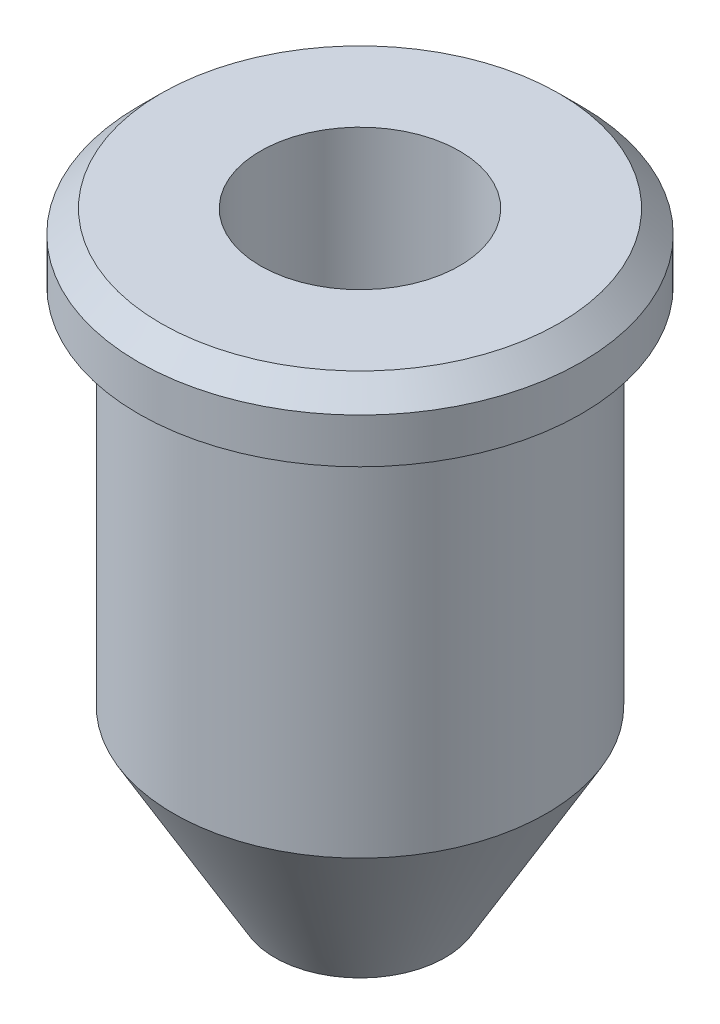
ISO-10303-21;
HEADER;
FILE_DESCRIPTION(('STEP AP214'),'2;1');
FILE_NAME('part.step','',(''),(''),'','','');
FILE_SCHEMA(('AUTOMOTIVE_DESIGN { 1 0 10303 214 1 1 1 1 }'));
ENDSEC;
DATA;
#1=APPLICATION_CONTEXT('core data for automotive mechanical design processes');
#2=APPLICATION_PROTOCOL_DEFINITION('international standard','automotive_design',2000,#1);
#3=PRODUCT_CONTEXT('',#1,'mechanical');
#4=PRODUCT('Part','Part','',(#3));
#5=PRODUCT_RELATED_PRODUCT_CATEGORY('part','',(#4));
#6=PRODUCT_DEFINITION_FORMATION('','',#4);
#7=PRODUCT_DEFINITION_CONTEXT('part definition',#1,'design');
#8=PRODUCT_DEFINITION('design','',#6,#7);
#9=PRODUCT_DEFINITION_SHAPE('','',#8);
#10=(LENGTH_UNIT() NAMED_UNIT(*) SI_UNIT(.MILLI.,.METRE.));
#11=(NAMED_UNIT(*) PLANE_ANGLE_UNIT() SI_UNIT($,.RADIAN.));
#12=(NAMED_UNIT(*) SI_UNIT($,.STERADIAN.) SOLID_ANGLE_UNIT());
#13=UNCERTAINTY_MEASURE_WITH_UNIT(LENGTH_MEASURE(1.E-05),#10,'distance_accuracy_value','');
#14=(GEOMETRIC_REPRESENTATION_CONTEXT(3) GLOBAL_UNCERTAINTY_ASSIGNED_CONTEXT((#13)) GLOBAL_UNIT_ASSIGNED_CONTEXT((#10,
#11,#12)) REPRESENTATION_CONTEXT('',''));
#15=CARTESIAN_POINT('',(0.,0.,0.));
#16=DIRECTION('',(0.,0.,1.));
#17=DIRECTION('',(1.,0.,0.));
#18=AXIS2_PLACEMENT_3D('',#15,#16,#17);
#19=CARTESIAN_POINT('',(0.,0.,0.));
#20=DIRECTION('',(0.,-1.,0.));
#21=DIRECTION('',(0.,0.,-1.));
#22=AXIS2_PLACEMENT_3D('',#19,#20,#21);
#23=PLANE('',#22);
#24=CARTESIAN_POINT('',(0.,0.,0.));
#25=DIRECTION('',(0.,-1.,0.));
#26=DIRECTION('',(0.,0.,-1.));
#27=AXIS2_PLACEMENT_3D('',#24,#25,#26);
#28=CIRCLE('',#27,2.90379624320715);
#29=CARTESIAN_POINT('',(0.,0.,-2.90379624320715));
#30=VERTEX_POINT('',#29);
#31=EDGE_CURVE('E10',#30,#30,#28,.T.);
#32=ORIENTED_EDGE('',*,*,#31,.T.);
#33=EDGE_LOOP('',(#32));
#34=FACE_BOUND('',#33,.T.);
#35=ADVANCED_FACE('F32',(#34),#23,.T.);
#36=CARTESIAN_POINT('',(0.,0.,0.));
#37=DIRECTION('',(0.,1.,0.));
#38=DIRECTION('',(0.,0.,1.));
#39=AXIS2_PLACEMENT_3D('',#36,#37,#38);
#40=CONICAL_SURFACE('',#39,2.90379624320715,0.523598775598296);
#41=CARTESIAN_POINT('',(0.,5.969,0.));
#42=DIRECTION('',(0.,-1.,0.));
#43=DIRECTION('',(0.,0.,-1.));
#44=AXIS2_PLACEMENT_3D('',#41,#42,#43);
#45=CIRCLE('',#44,6.35);
#46=CARTESIAN_POINT('',(0.,5.969,-6.35));
#47=VERTEX_POINT('',#46);
#48=EDGE_CURVE('E38',#47,#47,#45,.T.);
#49=ORIENTED_EDGE('',*,*,#48,.T.);
#50=EDGE_LOOP('',(#49));
#51=FACE_BOUND('',#50,.T.);
#52=ORIENTED_EDGE('',*,*,#31,.F.);
#53=EDGE_LOOP('',(#52));
#54=FACE_BOUND('',#53,.T.);
#55=ADVANCED_FACE('F76',(#51,#54),#40,.T.);
#56=CARTESIAN_POINT('',(0.,0.,0.));
#57=DIRECTION('',(0.,-1.,0.));
#58=DIRECTION('',(0.,0.,-1.));
#59=AXIS2_PLACEMENT_3D('',#56,#57,#58);
#60=CYLINDRICAL_SURFACE('',#59,6.35);
#61=CARTESIAN_POINT('',(0.,18.3515,0.));
#62=DIRECTION('',(0.,-1.,0.));
#63=DIRECTION('',(0.,0.,-1.));
#64=AXIS2_PLACEMENT_3D('',#61,#62,#63);
#65=CIRCLE('',#64,6.35);
#66=CARTESIAN_POINT('',(0.,18.3515,-6.35));
#67=VERTEX_POINT('',#66);
#68=EDGE_CURVE('E42',#67,#67,#65,.T.);
#69=ORIENTED_EDGE('',*,*,#68,.T.);
#70=EDGE_LOOP('',(#69));
#71=FACE_BOUND('',#70,.T.);
#72=ORIENTED_EDGE('',*,*,#48,.F.);
#73=EDGE_LOOP('',(#72));
#74=FACE_BOUND('',#73,.T.);
#75=ADVANCED_FACE('F80',(#71,#74),#60,.T.);
#76=CARTESIAN_POINT('',(6.35,18.3515,0.));
#77=DIRECTION('',(0.,-1.,0.));
#78=DIRECTION('',(0.,0.,-1.));
#79=AXIS2_PLACEMENT_3D('',#76,#77,#78);
#80=PLANE('',#79);
#81=CARTESIAN_POINT('',(0.,18.3515,0.));
#82=DIRECTION('',(0.,-1.,0.));
#83=DIRECTION('',(0.,0.,-1.));
#84=AXIS2_PLACEMENT_3D('',#81,#82,#83);
#85=CIRCLE('',#84,7.540625);
#86=CARTESIAN_POINT('',(0.,18.3515,-7.540625));
#87=VERTEX_POINT('',#86);
#88=EDGE_CURVE('E46',#87,#87,#85,.T.);
#89=ORIENTED_EDGE('',*,*,#88,.T.);
#90=EDGE_LOOP('',(#89));
#91=FACE_BOUND('',#90,.T.);
#92=ORIENTED_EDGE('',*,*,#68,.F.);
#93=EDGE_LOOP('',(#92));
#94=FACE_BOUND('',#93,.T.);
#95=ADVANCED_FACE('F84',(#91,#94),#80,.T.);
#96=CARTESIAN_POINT('',(0.,0.,0.));
#97=DIRECTION('',(0.,-1.,0.));
#98=DIRECTION('',(0.,0.,-1.));
#99=AXIS2_PLACEMENT_3D('',#96,#97,#98);
#100=CYLINDRICAL_SURFACE('',#99,7.540625);
#101=CARTESIAN_POINT('',(0.,19.8755,0.));
#102=DIRECTION('',(0.,-1.,0.));
#103=DIRECTION('',(0.,0.,-1.));
#104=AXIS2_PLACEMENT_3D('',#101,#102,#103);
#105=CIRCLE('',#104,7.540625);
#106=CARTESIAN_POINT('',(0.,19.8755,-7.540625));
#107=VERTEX_POINT('',#106);
#108=EDGE_CURVE('E51',#107,#107,#105,.T.);
#109=ORIENTED_EDGE('',*,*,#108,.T.);
#110=EDGE_LOOP('',(#109));
#111=FACE_BOUND('',#110,.T.);
#112=ORIENTED_EDGE('',*,*,#88,.F.);
#113=EDGE_LOOP('',(#112));
#114=FACE_BOUND('',#113,.T.);
#115=ADVANCED_FACE('F91',(#111,#114),#100,.T.);
#116=CARTESIAN_POINT('',(0.,19.8755,0.));
#117=DIRECTION('',(0.,-1.,0.));
#118=DIRECTION('',(0.,0.,-1.));
#119=AXIS2_PLACEMENT_3D('',#116,#117,#118);
#120=CONICAL_SURFACE('',#119,7.540625,0.785398163397447);
#121=CARTESIAN_POINT('',(0.,20.6375,0.));
#122=DIRECTION('',(0.,-1.,0.));
#123=DIRECTION('',(0.,0.,-1.));
#124=AXIS2_PLACEMENT_3D('',#121,#122,#123);
#125=CIRCLE('',#124,6.778625);
#126=CARTESIAN_POINT('',(0.,20.6375,-6.778625));
#127=VERTEX_POINT('',#126);
#128=EDGE_CURVE('E54',#127,#127,#125,.T.);
#129=ORIENTED_EDGE('',*,*,#128,.T.);
#130=EDGE_LOOP('',(#129));
#131=FACE_BOUND('',#130,.T.);
#132=ORIENTED_EDGE('',*,*,#108,.F.);
#133=EDGE_LOOP('',(#132));
#134=FACE_BOUND('',#133,.T.);
#135=ADVANCED_FACE('F95',(#131,#134),#120,.T.);
#136=CARTESIAN_POINT('',(3.3893125,20.6375,0.));
#137=DIRECTION('',(0.,1.,0.));
#138=DIRECTION('',(0.,0.,1.));
#139=AXIS2_PLACEMENT_3D('',#136,#137,#138);
#140=PLANE('',#139);
#141=CARTESIAN_POINT('',(0.,20.6375,0.));
#142=DIRECTION('',(0.,-1.,0.));
#143=DIRECTION('',(0.,0.,-1.));
#144=AXIS2_PLACEMENT_3D('',#141,#142,#143);
#145=CIRCLE('',#144,3.3893125);
#146=CARTESIAN_POINT('',(0.,20.6375,-3.3893125));
#147=VERTEX_POINT('',#146);
#148=EDGE_CURVE('E57',#147,#147,#145,.T.);
#149=ORIENTED_EDGE('',*,*,#148,.T.);
#150=EDGE_LOOP('',(#149));
#151=FACE_BOUND('',#150,.T.);
#152=ORIENTED_EDGE('',*,*,#128,.F.);
#153=EDGE_LOOP('',(#152));
#154=FACE_BOUND('',#153,.T.);
#155=ADVANCED_FACE('F73',(#151,#154),#140,.T.);
#156=CARTESIAN_POINT('',(0.,0.,0.));
#157=DIRECTION('',(0.,-1.,0.));
#158=DIRECTION('',(0.,0.,-1.));
#159=AXIS2_PLACEMENT_3D('',#156,#157,#158);
#160=CYLINDRICAL_SURFACE('',#159,3.3893125);
#161=CARTESIAN_POINT('',(0.,5.969,0.));
#162=DIRECTION('',(0.,-1.,0.));
#163=DIRECTION('',(0.,0.,-1.));
#164=AXIS2_PLACEMENT_3D('',#161,#162,#163);
#165=CIRCLE('',#164,3.3893125);
#166=CARTESIAN_POINT('',(0.,5.969,-3.3893125));
#167=VERTEX_POINT('',#166);
#168=EDGE_CURVE('E60',#167,#167,#165,.T.);
#169=ORIENTED_EDGE('',*,*,#168,.T.);
#170=EDGE_LOOP('',(#169));
#171=FACE_BOUND('',#170,.T.);
#172=ORIENTED_EDGE('',*,*,#148,.F.);
#173=EDGE_LOOP('',(#172));
#174=FACE_BOUND('',#173,.T.);
#175=ADVANCED_FACE('F64',(#171,#174),#160,.F.);
#176=CARTESIAN_POINT('',(0.,5.969,0.));
#177=DIRECTION('',(0.,1.,0.));
#178=DIRECTION('',(0.,0.,1.));
#179=AXIS2_PLACEMENT_3D('',#176,#177,#178);
#180=PLANE('',#179);
#181=ORIENTED_EDGE('',*,*,#168,.F.);
#182=EDGE_LOOP('',(#181));
#183=FACE_BOUND('',#182,.T.);
#184=ADVANCED_FACE('F67',(#183),#180,.T.);
#185=CLOSED_SHELL('',(#35,#55,#75,#95,#115,#135,#155,#175,#184));
#186=MANIFOLD_SOLID_BREP('B2',#185);
#187=ADVANCED_BREP_SHAPE_REPRESENTATION('',(#18,#186),#14);
#188=SHAPE_DEFINITION_REPRESENTATION(#9,#187);
ENDSEC;
END-ISO-10303-21;
